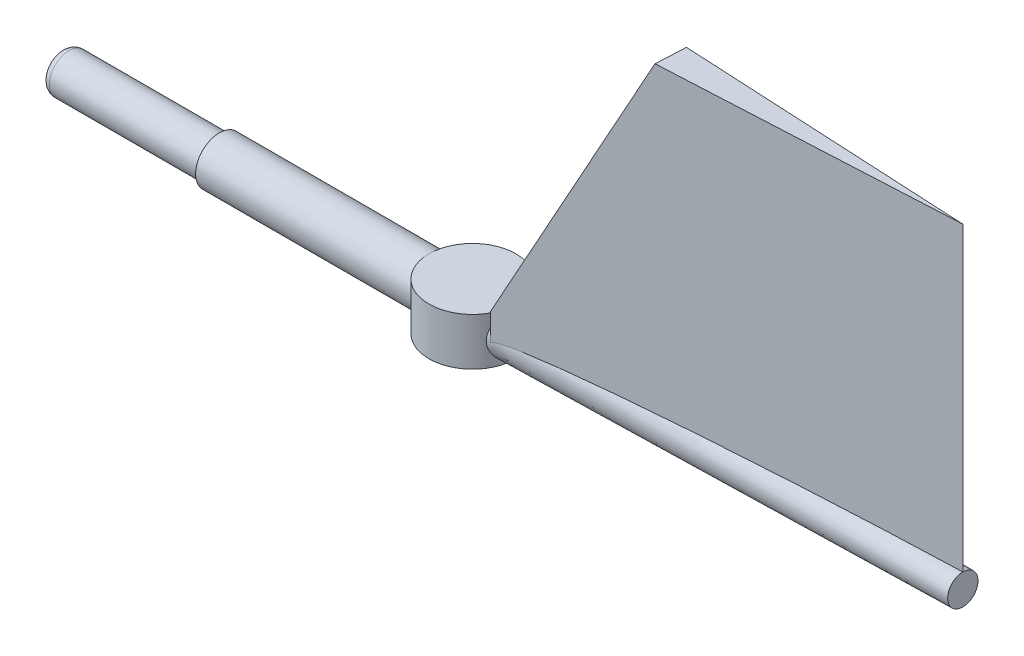
ISO-10303-21;
HEADER;
FILE_DESCRIPTION(('STEP AP214'),'2;1');
FILE_NAME('part.step','',(''),(''),'','','');
FILE_SCHEMA(('AUTOMOTIVE_DESIGN { 1 0 10303 214 1 1 1 1 }'));
ENDSEC;
DATA;
#1=APPLICATION_CONTEXT('core data for automotive mechanical design processes');
#2=APPLICATION_PROTOCOL_DEFINITION('international standard','automotive_design',2000,#1);
#3=PRODUCT_CONTEXT('',#1,'mechanical');
#4=PRODUCT('Part','Part','',(#3));
#5=PRODUCT_RELATED_PRODUCT_CATEGORY('part','',(#4));
#6=PRODUCT_DEFINITION_FORMATION('','',#4);
#7=PRODUCT_DEFINITION_CONTEXT('part definition',#1,'design');
#8=PRODUCT_DEFINITION('design','',#6,#7);
#9=PRODUCT_DEFINITION_SHAPE('','',#8);
#10=(LENGTH_UNIT() NAMED_UNIT(*) SI_UNIT(.MILLI.,.METRE.));
#11=(NAMED_UNIT(*) PLANE_ANGLE_UNIT() SI_UNIT($,.RADIAN.));
#12=(NAMED_UNIT(*) SI_UNIT($,.STERADIAN.) SOLID_ANGLE_UNIT());
#13=UNCERTAINTY_MEASURE_WITH_UNIT(LENGTH_MEASURE(1.E-05),#10,'distance_accuracy_value','');
#14=(GEOMETRIC_REPRESENTATION_CONTEXT(3) GLOBAL_UNCERTAINTY_ASSIGNED_CONTEXT((#13)) GLOBAL_UNIT_ASSIGNED_CONTEXT((#10,
#11,#12)) REPRESENTATION_CONTEXT('',''));
#15=CARTESIAN_POINT('',(0.,0.,0.));
#16=DIRECTION('',(0.,0.,1.));
#17=DIRECTION('',(1.,0.,0.));
#18=AXIS2_PLACEMENT_3D('',#15,#16,#17);
#19=CARTESIAN_POINT('',(0.,30.,0.));
#20=DIRECTION('',(0.,1.,0.));
#21=DIRECTION('',(0.,0.,1.));
#22=AXIS2_PLACEMENT_3D('',#19,#20,#21);
#23=PLANE('',#22);
#24=DIRECTION('',(-0.0511518511842649,0.,0.998690887172013));
#25=VECTOR('',#24,1.);
#26=CARTESIAN_POINT('',(25.188881317331,30.,1.29014685644198));
#27=LINE('',#26,#25);
#28=CARTESIAN_POINT('',(25.7494686858501,30.,-9.65478443034477));
#29=VERTEX_POINT('',#28);
#30=CARTESIAN_POINT('',(24.6282939488119,30.,12.2350781432287));
#31=VERTEX_POINT('',#30);
#32=EDGE_CURVE('E234',#29,#31,#27,.T.);
#33=ORIENTED_EDGE('',*,*,#32,.F.);
#34=CARTESIAN_POINT('',(0.,30.,0.));
#35=DIRECTION('',(0.,1.,0.));
#36=DIRECTION('',(0.,0.,1.));
#37=AXIS2_PLACEMENT_3D('',#34,#35,#36);
#38=CIRCLE('',#37,27.5);
#39=CARTESIAN_POINT('',(-27.5,30.,0.));
#40=VERTEX_POINT('',#39);
#41=EDGE_CURVE('E236',#29,#40,#38,.T.);
#42=ORIENTED_EDGE('',*,*,#41,.T.);
#43=EDGE_CURVE('E188',#40,#31,#38,.T.);
#44=ORIENTED_EDGE('',*,*,#43,.T.);
#45=EDGE_LOOP('',(#33,#42,#44));
#46=FACE_BOUND('',#45,.T.);
#47=ADVANCED_FACE('F45',(#46),#23,.T.);
#48=CARTESIAN_POINT('',(0.,30.,0.));
#49=DIRECTION('',(0.,-1.,0.));
#50=DIRECTION('',(0.,0.,-1.));
#51=AXIS2_PLACEMENT_3D('',#48,#49,#50);
#52=CYLINDRICAL_SURFACE('',#51,27.5);
#53=ORIENTED_EDGE('',*,*,#41,.F.);
#54=DIRECTION('',(0.,-1.,0.));
#55=VECTOR('',#54,1.);
#56=CARTESIAN_POINT('',(25.7494686858501,30.,-9.65478443034477));
#57=LINE('',#56,#55);
#58=CARTESIAN_POINT('',(25.74946868585,29.7622417594212,-9.65478443034478));
#59=VERTEX_POINT('',#58);
#60=EDGE_CURVE('E248',#29,#59,#57,.T.);
#61=ORIENTED_EDGE('',*,*,#60,.T.);
#62=CARTESIAN_POINT('',(0.,-16.9582397002913,0.));
#63=DIRECTION('',(0.878809806357377,-0.475044496307877,0.0450116737936376));
#64=DIRECTION('',(-0.474422609463896,-0.879961775605961,-0.0242994053810446));
#65=AXIS2_PLACEMENT_3D('',#62,#63,#64);
#66=ELLIPSE('',#65,57.8893139773946,27.5);
#67=CARTESIAN_POINT('',(25.8622948656145,30.,-9.34835302521294));
#68=VERTEX_POINT('',#67);
#69=EDGE_CURVE('E243',#59,#68,#66,.T.);
#70=ORIENTED_EDGE('',*,*,#69,.T.);
#71=CARTESIAN_POINT('',(26.,30.,-8.95823643358439));
#72=VERTEX_POINT('',#71);
#73=EDGE_CURVE('E251',#72,#68,#38,.T.);
#74=ORIENTED_EDGE('',*,*,#73,.F.);
#75=DIRECTION('',(0.,-1.,0.));
#76=VECTOR('',#75,1.);
#77=CARTESIAN_POINT('',(26.,30.,-8.95823643358439));
#78=LINE('',#77,#76);
#79=CARTESIAN_POINT('',(26.,26.4604106626746,-8.95823643358439));
#80=VERTEX_POINT('',#79);
#81=EDGE_CURVE('E156',#80,#72,#78,.F.);
#82=ORIENTED_EDGE('',*,*,#81,.F.);
#83=CARTESIAN_POINT('',(25.3739548760708,5.02520029589029,-10.6024720677361));
#84=CARTESIAN_POINT('',(25.2589807896453,5.31474524438891,-10.8776317207242));
#85=CARTESIAN_POINT('',(25.1437529125648,5.61552790973988,-11.1408027092725));
#86=CARTESIAN_POINT('',(24.9156567978218,6.23838173601328,-11.6419868356179));
#87=CARTESIAN_POINT('',(24.8027891652163,6.56045826972817,-11.8799935843871));
#88=CARTESIAN_POINT('',(24.5823460763896,7.22493664086616,-12.3296825254285));
#89=CARTESIAN_POINT('',(24.4747782842272,7.56736641945178,-12.5413272342094));
#90=CARTESIAN_POINT('',(24.2682963971694,8.27062803539316,-12.9363624297135));
#91=CARTESIAN_POINT('',(24.1693814022499,8.63145795265656,-13.1197558565181));
#92=CARTESIAN_POINT('',(23.9828436160495,9.37215898739739,-13.4577389026124));
#93=CARTESIAN_POINT('',(23.8952970187322,9.75213704225914,-13.6121369825039));
#94=CARTESIAN_POINT('',(23.7355478572148,10.5265132873885,-13.8888196629213));
#95=CARTESIAN_POINT('',(23.6633358988442,10.9209024746401,-14.0111239353594));
#96=CARTESIAN_POINT('',(23.5372636868414,11.7209711468181,-14.2218957167232));
#97=CARTESIAN_POINT('',(23.4833798033984,12.1266353592669,-14.3104068123089));
#98=CARTESIAN_POINT('',(23.3962990579469,12.9462341609028,-14.4523418384537));
#99=CARTESIAN_POINT('',(23.3630988876827,13.3601674165618,-14.5057713802043));
#100=CARTESIAN_POINT('',(23.321409946645,14.1465238990861,-14.5726857244963));
#101=CARTESIAN_POINT('',(23.3106067160397,14.5185105282431,-14.5899145953292));
#102=CARTESIAN_POINT('',(23.3070786393187,15.2627749480068,-14.5955511733385));
#103=CARTESIAN_POINT('',(23.3143524374883,15.635052714686,-14.5839610418406));
#104=CARTESIAN_POINT('',(23.3466885029954,16.376865656022,-14.5321385998695));
#105=CARTESIAN_POINT('',(23.3717532036468,16.7464004485274,-14.4919023713833));
#106=CARTESIAN_POINT('',(23.4386902785931,17.4797653997153,-14.3833877749931));
#107=CARTESIAN_POINT('',(23.4805626844626,17.8435955476798,-14.3151093544095));
#108=CARTESIAN_POINT('',(23.5762929425411,18.5391974846344,-14.1568484769866));
#109=CARTESIAN_POINT('',(23.6291768894959,18.8714998528014,-14.0685967309989));
#110=CARTESIAN_POINT('',(23.7466645207108,19.5271482386261,-13.8693640153953));
#111=CARTESIAN_POINT('',(23.8112721677085,19.8504911851739,-13.7583753588165));
#112=CARTESIAN_POINT('',(24.0200117773653,20.8045769240625,-13.3928343874975));
#113=CARTESIAN_POINT('',(24.1791217073796,21.4197953380689,-13.1056103540417));
#114=CARTESIAN_POINT('',(24.5422598365895,22.6683134964539,-12.4135724270906));
#115=CARTESIAN_POINT('',(24.7493693678085,23.2952414686588,-11.9989062342224));
#116=CARTESIAN_POINT('',(25.0677300994055,24.1805027246535,-11.3103151053874));
#117=CARTESIAN_POINT('',(25.1752201251041,24.466603389379,-11.0694717123964));
#118=CARTESIAN_POINT('',(25.3903993188432,25.019374350434,-10.5665660557872));
#119=CARTESIAN_POINT('',(25.4980884203296,25.286050240048,-10.3045099465373));
#120=CARTESIAN_POINT('',(25.7246989046915,25.8309661974467,-9.72615145501654));
#121=CARTESIAN_POINT('',(25.8433397231763,26.106478104043,-9.40716432386659));
#122=CARTESIAN_POINT('',(26.07478771349,26.6298179880697,-8.74519209254233));
#123=CARTESIAN_POINT('',(26.1875943767586,26.8776435542739,-8.40220490640742));
#124=CARTESIAN_POINT('',(26.4043337401277,27.343708338476,-7.69403990666647));
#125=CARTESIAN_POINT('',(26.5082670286885,27.5619495190026,-7.32886356734413));
#126=CARTESIAN_POINT('',(26.7044001939237,27.9668742978705,-6.5784024134819));
#127=CARTESIAN_POINT('',(26.7966008619495,28.1535600248687,-6.19311895761753));
#128=CARTESIAN_POINT('',(26.9643247301294,28.4887691710254,-5.4156277171668));
#129=CARTESIAN_POINT('',(27.0402320135855,28.6381892935451,-5.02389015001652));
#130=CARTESIAN_POINT('',(27.176276844047,28.9034928477338,-4.22652428886465));
#131=CARTESIAN_POINT('',(27.2364144631062,29.0193764326362,-3.82089605834098));
#132=CARTESIAN_POINT('',(27.3390767482759,29.2159666478532,-2.99935021046283));
#133=CARTESIAN_POINT('',(27.3816155749622,29.2967015627089,-2.583441152116));
#134=CARTESIAN_POINT('',(27.44781920486,29.4219297574201,-1.74473187394965));
#135=CARTESIAN_POINT('',(27.4714861980969,29.4664272425445,-1.32193245954995));
#136=CARTESIAN_POINT('',(27.4976824595051,29.515648503416,-0.519979469652379));
#137=CARTESIAN_POINT('',(27.5022441836775,29.5241970666347,-0.141121207491285));
#138=CARTESIAN_POINT('',(27.4957059959917,29.5119277203421,0.615964382808418));
#139=CARTESIAN_POINT('',(27.484607392897,29.4911122648383,0.994191761026542));
#140=CARTESIAN_POINT('',(27.4470349072439,29.4203831666642,1.7470988535439));
#141=CARTESIAN_POINT('',(27.4205623724584,29.3704720746942,2.12177887590021));
#142=CARTESIAN_POINT('',(27.3529101857643,29.2421633051996,2.86487370013073));
#143=CARTESIAN_POINT('',(27.3117303752413,29.1637653204505,3.23328843439041));
#144=CARTESIAN_POINT('',(27.2172049432116,28.9823243275214,3.94970172019371));
#145=CARTESIAN_POINT('',(27.1642884666744,28.8801455718904,4.29797682160703));
#146=CARTESIAN_POINT('',(27.0467912052996,28.6509475468669,4.98420184498652));
#147=CARTESIAN_POINT('',(26.9822108111078,28.5239291093887,5.32215211230707));
#148=CARTESIAN_POINT('',(26.8427480914521,28.2461625241432,5.98597766963605));
#149=CARTESIAN_POINT('',(26.7678647374124,28.095412006913,6.3118517499136));
#150=CARTESIAN_POINT('',(26.6093197655124,27.7713574321773,6.9499797430459));
#151=CARTESIAN_POINT('',(26.5256572607284,27.5980510955188,7.26223227524816));
#152=CARTESIAN_POINT('',(26.3442575516158,27.2154299123784,7.89602426583035));
#153=CARTESIAN_POINT('',(26.2459301722321,27.0043476807044,8.21632829137412));
#154=CARTESIAN_POINT('',(26.0431389937305,26.5587006428767,8.83809183243358));
#155=CARTESIAN_POINT('',(25.9386749341642,26.3241348397529,9.13955054700836));
#156=CARTESIAN_POINT('',(25.7258315340878,25.832716158324,9.72254826084306));
#157=CARTESIAN_POINT('',(25.6174500012751,25.5758506843077,10.0040758371021));
#158=CARTESIAN_POINT('',(25.3991739959588,25.0411084167323,10.5459625070168));
#159=CARTESIAN_POINT('',(25.2892790255165,24.7632245659338,10.8063144291845));
#160=CARTESIAN_POINT('',(25.0593718645805,24.1584401910722,11.3299480019948));
#161=CARTESIAN_POINT('',(24.9394653561803,23.8294275551818,11.5908431125327));
#162=CARTESIAN_POINT('',(24.7043175806498,23.1489098396518,12.0839286020567));
#163=CARTESIAN_POINT('',(24.5890768791427,22.7974020462345,12.3161155077893));
#164=CARTESIAN_POINT('',(24.3668657227974,22.0734683623982,12.7501104539683));
#165=CARTESIAN_POINT('',(24.2598971690574,21.7010376972542,12.9519115211983));
#166=CARTESIAN_POINT('',(24.0580426601057,20.9374374553736,13.3231087578596));
#167=CARTESIAN_POINT('',(23.9631501934803,20.5462781350461,13.4925224155111));
#168=CARTESIAN_POINT('',(23.791190924837,19.7570559686598,13.7934248917212));
#169=CARTESIAN_POINT('',(23.7137493997712,19.3593871515913,13.9257298385366));
#170=CARTESIAN_POINT('',(23.5770776281361,18.5511024140894,14.155895453191));
#171=CARTESIAN_POINT('',(23.5178470653846,18.1404867185786,14.2537567190519));
#172=CARTESIAN_POINT('',(23.4204107678903,17.3104488084701,14.4132966956237));
#173=CARTESIAN_POINT('',(23.3821733768986,16.891040849077,14.4750298942799));
#174=CARTESIAN_POINT('',(23.3285058876373,16.046995363706,14.5613686915601));
#175=CARTESIAN_POINT('',(23.3130716982874,15.6223587895717,14.5859809499999));
#176=CARTESIAN_POINT('',(23.3063287773289,14.8358525880745,14.5967456484932));
#177=CARTESIAN_POINT('',(23.3117646902336,14.4740688887894,14.5880874717275));
#178=CARTESIAN_POINT('',(23.3394815272933,13.7528470460417,14.5437031762805));
#179=CARTESIAN_POINT('',(23.3617605637132,13.3934086442771,14.5079800909653));
#180=CARTESIAN_POINT('',(23.4223461133257,12.6794641575445,14.4099617863203));
#181=CARTESIAN_POINT('',(23.460657114004,12.3249594822984,14.3476591270421));
#182=CARTESIAN_POINT('',(23.5519533780984,11.6233917410921,14.1972958516751));
#183=CARTESIAN_POINT('',(23.6049391905956,11.2763289541055,14.109234271769));
#184=CARTESIAN_POINT('',(23.7222882926122,10.6006797677343,13.9110003700438));
#185=CARTESIAN_POINT('',(23.7863185557411,10.2718475577895,13.8014650888252));
#186=CARTESIAN_POINT('',(23.9248357137863,9.62470144712515,13.5599266571158));
#187=CARTESIAN_POINT('',(23.9993262114333,9.30639121726544,13.427915762196));
#188=CARTESIAN_POINT('',(24.1568080322295,8.68170995146564,13.1424951265262));
#189=CARTESIAN_POINT('',(24.2397994761879,8.37533908528448,12.9890850816559));
#190=CARTESIAN_POINT('',(24.4123215503151,7.77559924336337,12.6618626518122));
#191=CARTESIAN_POINT('',(24.5018528536115,7.48223161101371,12.4880481655514));
#192=CARTESIAN_POINT('',(24.6982793337174,6.86962267055965,12.0954381981639));
#193=CARTESIAN_POINT('',(24.8058583961206,6.5524520305818,11.8737485657057));
#194=CARTESIAN_POINT('',(25.0241563702376,5.93755850739902,11.4064925926397));
#195=CARTESIAN_POINT('',(25.1348743399519,5.63982987633875,11.1609333627809));
#196=CARTESIAN_POINT('',(25.3569353055377,5.06459216496888,10.6467982657943));
#197=CARTESIAN_POINT('',(25.4682788360287,4.78710466512718,10.3781984785096));
#198=CARTESIAN_POINT('',(25.6888701437659,4.25402674771146,9.81947733492268));
#199=CARTESIAN_POINT('',(25.7981186034398,3.99842910259539,9.5293631416911));
#200=CARTESIAN_POINT('',(26.0227296767489,3.48609170814852,8.89889442872867));
#201=CARTESIAN_POINT('',(26.1376228424649,3.23175676429353,8.55641140071042));
#202=CARTESIAN_POINT('',(26.3588304631927,2.75288297493598,7.84853877678495));
#203=CARTESIAN_POINT('',(26.4651442512195,2.52834644517303,7.48314740383485));
#204=CARTESIAN_POINT('',(26.666183578984,2.11118350459486,6.73170409179548));
#205=CARTESIAN_POINT('',(26.7609135765313,1.91854480831209,6.34566018319344));
#206=CARTESIAN_POINT('',(26.9360742008022,1.56715840803802,5.55532732435332));
#207=CARTESIAN_POINT('',(27.016506278345,1.40840726512579,5.15104023048904));
#208=CARTESIAN_POINT('',(27.1563953097858,1.13504578195875,4.35145072526543));
#209=CARTESIAN_POINT('',(27.2168065315474,1.01839100319289,3.95701453544945));
#210=CARTESIAN_POINT('',(27.3210861179503,0.818331138354284,3.15763692159677));
#211=CARTESIAN_POINT('',(27.3649549894543,0.734925033527394,2.75269581984021));
#212=CARTESIAN_POINT('',(27.4348282741273,0.602570259093007,1.93598782842031));
#213=CARTESIAN_POINT('',(27.4608454468289,0.553596977945974,1.52422602990169));
#214=CARTESIAN_POINT('',(27.494271218503,0.490742243127113,0.697294240145706));
#215=CARTESIAN_POINT('',(27.501681506155,0.476857604963127,0.282124561623907));
#216=CARTESIAN_POINT('',(27.497885215065,0.48398388355591,-0.504613086786452));
#217=CARTESIAN_POINT('',(27.4885337906107,0.501517432419844,-0.876227286644535));
#218=CARTESIAN_POINT('',(27.4549555929053,0.564691646689673,-1.61635658718643));
#219=CARTESIAN_POINT('',(27.4307299977756,0.610330086024461,-1.98487193097465));
#220=CARTESIAN_POINT('',(27.3679869526378,0.729185080219863,-2.71625778760095));
#221=CARTESIAN_POINT('',(27.329466478021,0.802407471531994,-3.07912708886844));
#222=CARTESIAN_POINT('',(27.2390488232539,0.97561006762349,-3.79671015581259));
#223=CARTESIAN_POINT('',(27.1871514263604,1.07559070596162,-4.15142378924339));
#224=CARTESIAN_POINT('',(27.07143162372,1.30076754647395,-4.84891886013749));
#225=CARTESIAN_POINT('',(27.0076642293836,1.42584762610448,-5.19174701943964));
#226=CARTESIAN_POINT('',(26.8694388353132,1.70035583966426,-5.86527633034215));
#227=CARTESIAN_POINT('',(26.7949804378047,1.84978487956006,-6.19597703014767));
#228=CARTESIAN_POINT('',(26.6369754194599,2.17168046962517,-6.84342837755385));
#229=CARTESIAN_POINT('',(26.5534344654054,2.3441326703416,-7.16018755217063));
#230=CARTESIAN_POINT('',(26.3789242583845,2.71088796406311,-7.77853394346995));
#231=CARTESIAN_POINT('',(26.2879560758362,2.90518790987085,-8.08012333634425));
#232=CARTESIAN_POINT('',(26.0649709461134,3.39166133444143,-8.7776474029461));
#233=CARTESIAN_POINT('',(25.9303994272193,3.69313231412289,-9.16632626306055));
#234=CARTESIAN_POINT('',(25.6553309164623,4.33250951580472,-9.91016253755733));
#235=CARTESIAN_POINT('',(25.514833413983,4.67041888146467,-10.2653170547192));
#236=CARTESIAN_POINT('',(25.3739548760708,5.02520029589029,-10.6024720677361));
#237=B_SPLINE_CURVE_WITH_KNOTS('',3,(#83,#84,#85,#86,#87,#88,#89,#90,#91,#92,#93,#94,#95,#96,
#97,#98,#99,#100,#101,#102,#103,#104,#105,#106,#107,#108,#109,#110,#111,#112,#113,#114,#115,
#116,#117,#118,#119,#120,#121,#122,#123,#124,#125,#126,#127,#128,#129,#130,#131,#132,#133,#134,
#135,#136,#137,#138,#139,#140,#141,#142,#143,#144,#145,#146,#147,#148,#149,#150,#151,#152,#153,
#154,#155,#156,#157,#158,#159,#160,#161,#162,#163,#164,#165,#166,#167,#168,#169,#170,#171,#172,
#173,#174,#175,#176,#177,#178,#179,#180,#181,#182,#183,#184,#185,#186,#187,#188,#189,#190,#191,
#192,#193,#194,#195,#196,#197,#198,#199,#200,#201,#202,#203,#204,#205,#206,#207,#208,#209,#210,
#211,#212,#213,#214,#215,#216,#217,#218,#219,#220,#221,#222,#223,#224,#225,#226,#227,#228,#229,
#230,#231,#232,#233,#234,#235,#236),.UNSPECIFIED.,.T.,.F.,(4,2,2,2,2,2,2,2,2,2,2,2,2,2,2,2,2,2,
2,2,2,2,2,2,2,2,2,2,2,2,2,2,2,2,2,2,2,2,2,2,2,2,2,2,2,2,2,2,2,2,2,2,2,2,2,2,2,2,2,2,2,2,2,2,2,2,
2,2,2,2,2,2,2,2,2,2,4),(0.,1.24657017777306,2.49345609496434,3.74209516444599,4.99060420144898,
6.24709099992977,7.50280582575517,8.75689550640142,10.010784550193,11.1268950195776,
12.2429217870584,13.3591012262182,14.4752827622261,15.517766388665,16.560603044473,
18.6449878448924,20.9743285440373,22.1408240271324,23.3069822838403,24.6190556785266,
25.931243253832,27.2433437403745,28.5553556803371,29.8318304024429,31.1082992920579,
32.3837390851638,33.659030845369,34.7945463874952,35.9299670380209,37.0652881656386,
38.2006215377942,39.2998029742727,40.3989476039942,41.498202044409,42.5975676453691,
43.7843390597823,44.9711608786943,46.1586574768928,47.346554580386,48.6550636121095,
49.9637307988183,51.2726978540427,52.5809560978885,53.8576617178647,55.1343451701885,
56.4090981473951,57.6836223957467,58.7680260098334,59.8523081046978,60.9368939027471,
62.0215202877525,63.0778394751476,64.1345233781331,65.1912223000193,66.2480301383499,
67.4517143936581,68.6550411641869,69.8596326801444,71.0638249210045,72.3875424376168,
73.7113627648109,75.0346720299224,76.3578469412317,77.6033317359527,78.8487783655326,
80.0933338800955,81.3377764401724,82.4528589302165,83.5678531105871,84.6830833437151,
85.7983316477999,86.9085345228061,88.0187787152414,89.1283341376688,90.2377299314001,
91.765029062839,93.2924600649835),.UNSPECIFIED.);
#238=CARTESIAN_POINT('',(26.,26.4604106626746,8.95823643358439));
#239=VERTEX_POINT('',#238);
#240=EDGE_CURVE('E173',#239,#80,#237,.T.);
#241=ORIENTED_EDGE('',*,*,#240,.F.);
#242=DIRECTION('',(0.,-1.,0.));
#243=VECTOR('',#242,1.);
#244=CARTESIAN_POINT('',(26.,30.,8.95823643358439));
#245=LINE('',#244,#243);
#246=CARTESIAN_POINT('',(26.,30.,8.95823643358439));
#247=VERTEX_POINT('',#246);
#248=EDGE_CURVE('E163',#247,#239,#245,.T.);
#249=ORIENTED_EDGE('',*,*,#248,.F.);
#250=CARTESIAN_POINT('',(24.7718377342979,30.,11.9417777263527));
#251=VERTEX_POINT('',#250);
#252=EDGE_CURVE('E253',#251,#247,#38,.T.);
#253=ORIENTED_EDGE('',*,*,#252,.F.);
#254=CARTESIAN_POINT('',(24.6282939488119,29.7622417594212,12.2350781432287));
#255=VERTEX_POINT('',#254);
#256=EDGE_CURVE('E61',#251,#255,#66,.T.);
#257=ORIENTED_EDGE('',*,*,#256,.T.);
#258=DIRECTION('',(0.,-1.,0.));
#259=VECTOR('',#258,1.);
#260=CARTESIAN_POINT('',(24.6282939488119,30.,12.2350781432287));
#261=LINE('',#260,#259);
#262=EDGE_CURVE('E242',#255,#31,#261,.F.);
#263=ORIENTED_EDGE('',*,*,#262,.T.);
#264=ORIENTED_EDGE('',*,*,#43,.F.);
#265=CARTESIAN_POINT('',(-27.5,30.,0.));
#266=CARTESIAN_POINT('',(-27.5000029768637,30.0000033905131,0.390025926031639));
#267=CARTESIAN_POINT('',(-27.4916861614045,29.9847736809685,0.780011319275115));
#268=CARTESIAN_POINT('',(-27.4586380253817,29.9240565910686,1.55705345313805));
#269=CARTESIAN_POINT('',(-27.433901642081,29.8785598783093,1.94410925321924));
#270=CARTESIAN_POINT('',(-27.3686019985479,29.7578097587313,2.71267021647318));
#271=CARTESIAN_POINT('',(-27.3280191771369,29.6825195726702,3.0941679125022));
#272=CARTESIAN_POINT('',(-27.2320495631699,29.5031121824854,3.84837478107718));
#273=CARTESIAN_POINT('',(-27.1766637496011,29.3989968846772,4.2210845330355));
#274=CARTESIAN_POINT('',(-27.0526800176246,29.1635962338135,4.9537874968714));
#275=CARTESIAN_POINT('',(-26.9841378431476,29.0324253472095,5.31382703510725));
#276=CARTESIAN_POINT('',(-26.835260068349,28.7439601547889,6.02073993698791));
#277=CARTESIAN_POINT('',(-26.7549243141161,28.5866655080422,6.36761312873177));
#278=CARTESIAN_POINT('',(-26.5842202055101,28.247349064103,7.04639678409534));
#279=CARTESIAN_POINT('',(-26.4938530255157,28.0653301608215,7.37830899281341));
#280=CARTESIAN_POINT('',(-26.3049560932214,27.6779067054886,8.02577344173227));
#281=CARTESIAN_POINT('',(-26.2064255180262,27.4724997950711,8.34132402740591));
#282=CARTESIAN_POINT('',(-25.9962766794739,27.0248936742744,8.97567240061469));
#283=CARTESIAN_POINT('',(-25.8842240637397,26.7811422470175,9.29323125552219));
#284=CARTESIAN_POINT('',(-25.655600915709,26.2699652949713,9.90693648044711));
#285=CARTESIAN_POINT('',(-25.5390302178094,26.0025389019508,10.2030820644522));
#286=CARTESIAN_POINT('',(-25.3039217654193,25.4452061124606,10.772957453928));
#287=CARTESIAN_POINT('',(-25.1853828103385,25.1552855671109,11.0466729245871));
#288=CARTESIAN_POINT('',(-24.949095424736,24.5542529337534,11.5704465235238));
#289=CARTESIAN_POINT('',(-24.83134739803,24.2431308088024,11.8204933112118));
#290=CARTESIAN_POINT('',(-24.5883351282199,23.5699503034928,12.3185959703622));
#291=CARTESIAN_POINT('',(-24.4634457148746,23.2058760189773,12.5641191834341));
#292=CARTESIAN_POINT('',(-24.2221333137375,22.455720496586,13.0232682298902));
#293=CARTESIAN_POINT('',(-24.1057061765752,22.0696502121131,13.2369097509271));
#294=CARTESIAN_POINT('',(-23.8853676018497,21.2773780133631,13.6304838253342));
#295=CARTESIAN_POINT('',(-23.7814524105911,20.8711821888063,13.8104264977025));
#296=CARTESIAN_POINT('',(-23.5902234111617,20.0409977119816,14.1345968487277));
#297=CARTESIAN_POINT('',(-23.5029074434359,19.6170113830274,14.2788291740314));
#298=CARTESIAN_POINT('',(-23.3536203509628,18.7814952678535,14.5216202180834));
#299=CARTESIAN_POINT('',(-23.2904005035301,18.3708593998965,14.6224811449739));
#300=CARTESIAN_POINT('',(-23.1847259735726,17.539925746271,14.7894657297646));
#301=CARTESIAN_POINT('',(-23.1422702285126,17.1196284561469,14.8555911651531));
#302=CARTESIAN_POINT('',(-23.0801812722155,16.2737508412634,14.951873960348));
#303=CARTESIAN_POINT('',(-23.0605210217293,15.8481773820625,14.9820739348353));
#304=CARTESIAN_POINT('',(-23.0449228176138,14.995594891239,15.0060578570553));
#305=CARTESIAN_POINT('',(-23.0489817247583,14.568586057064,14.9998466238043));
#306=CARTESIAN_POINT('',(-23.0782283378165,13.7811208460319,14.954794835107));
#307=CARTESIAN_POINT('',(-23.1001725194712,13.4202423862242,14.9209620037933));
#308=CARTESIAN_POINT('',(-23.1602570339157,12.7032459772465,14.8275280005585));
#309=CARTESIAN_POINT('',(-23.1983954450444,12.347127468415,14.7679298860161));
#310=CARTESIAN_POINT('',(-23.2895875400534,11.6418358424278,14.6236920147679));
#311=CARTESIAN_POINT('',(-23.3426466544308,11.2926653036719,14.5390431400696));
#312=CARTESIAN_POINT('',(-23.4619907126698,10.6033801640077,14.3456573247184));
#313=CARTESIAN_POINT('',(-23.5282764720741,10.2632661229811,14.2369188986805));
#314=CARTESIAN_POINT('',(-23.6736941826906,9.58655730182434,13.993808592953));
#315=CARTESIAN_POINT('',(-23.7530721050962,9.25019616426513,13.8589349805158));
#316=CARTESIAN_POINT('',(-23.9214582195211,8.58999949107903,13.5662205947533));
#317=CARTESIAN_POINT('',(-24.0104698077622,8.26616842773866,13.4083717149935));
#318=CARTESIAN_POINT('',(-24.1959004001043,7.63226681705534,13.0707874760883));
#319=CARTESIAN_POINT('',(-24.2923208294074,7.32219893545721,12.8910479020284));
#320=CARTESIAN_POINT('',(-24.4903603605917,6.71691186367087,12.510724003029));
#321=CARTESIAN_POINT('',(-24.5919792512718,6.42169207120546,12.3101405245861));
#322=CARTESIAN_POINT('',(-24.8142981239363,5.80242607535837,11.8563873360525));
#323=CARTESIAN_POINT('',(-24.9355149880728,5.48100086539305,11.5998852325036));
#324=CARTESIAN_POINT('',(-25.1789315319098,4.86047045099108,11.0615853728645));
#325=CARTESIAN_POINT('',(-25.3011312701528,4.56136658714009,10.7797860997006));
#326=CARTESIAN_POINT('',(-25.5436170163428,3.98663051419691,10.1918989000826));
#327=CARTESIAN_POINT('',(-25.6639013045802,3.7110185257947,9.88579047857691));
#328=CARTESIAN_POINT('',(-25.8995157920741,3.18517263901833,9.25092860627508));
#329=CARTESIAN_POINT('',(-26.0148479046461,2.93492888761503,8.92218403132097));
#330=CARTESIAN_POINT('',(-26.2451366569457,2.44584743317257,8.22116899818339));
#331=CARTESIAN_POINT('',(-26.3595761221473,2.2088240902676,7.84745806399649));
#332=CARTESIAN_POINT('',(-26.5765607059835,1.76744477280032,7.07786999641931));
#333=CARTESIAN_POINT('',(-26.6791050829843,1.56309083480689,6.68199148320607));
#334=CARTESIAN_POINT('',(-26.8692348010223,1.18943764326643,5.87090841300042));
#335=CARTESIAN_POINT('',(-26.9568311649418,1.02011253921538,5.45571838663561));
#336=CARTESIAN_POINT('',(-27.1144564172653,0.718533268343672,4.60886601765793));
#337=CARTESIAN_POINT('',(-27.1844877596501,0.586273922822533,4.17720598576208));
#338=CARTESIAN_POINT('',(-27.2991774682105,0.37117352230469,3.34156229985676));
#339=CARTESIAN_POINT('',(-27.3455807843775,0.284898634850698,2.93870005602793));
#340=CARTESIAN_POINT('',(-27.4207641371914,0.145648612919121,2.12563247046865));
#341=CARTESIAN_POINT('',(-27.4495452257549,0.0926714908067882,1.71542756854521));
#342=CARTESIAN_POINT('',(-27.488643235048,0.0208005861741679,0.891380587975852));
#343=CARTESIAN_POINT('',(-27.4989697634382,0.00188906865969596,0.477540514684416));
#344=CARTESIAN_POINT('',(-27.5008830923673,-0.00161930343297784,-0.350316913442313));
#345=CARTESIAN_POINT('',(-27.4924710652538,0.0137816952812828,-0.764334255566828));
#346=CARTESIAN_POINT('',(-27.4588592415785,0.0755393469310441,-1.54928782157928));
#347=CARTESIAN_POINT('',(-27.4353473792204,0.118784563958674,-1.92054665490984));
#348=CARTESIAN_POINT('',(-27.3737813435291,0.232596727132049,-2.65759801913595));
#349=CARTESIAN_POINT('',(-27.3357283282121,0.303161497631945,-3.02339098290806));
#350=CARTESIAN_POINT('',(-27.2459535727828,0.470822709588658,-3.74713343528903));
#351=CARTESIAN_POINT('',(-27.194231148095,0.56792047984858,-4.10508253009785));
#352=CARTESIAN_POINT('',(-27.0782660216347,0.787639413252548,-4.81097326625502));
#353=CARTESIAN_POINT('',(-27.0140227733037,0.910261690607092,-5.15891446997822));
#354=CARTESIAN_POINT('',(-26.872768976388,1.18299482064512,-5.85079671163859));
#355=CARTESIAN_POINT('',(-26.7954977463648,1.33367531077708,-6.19445960371795));
#356=CARTESIAN_POINT('',(-26.6309248216772,1.65923990728275,-6.86759887040171));
#357=CARTESIAN_POINT('',(-26.5436230894613,1.8341241042694,-7.1970751918889));
#358=CARTESIAN_POINT('',(-26.3607434362847,2.20683127805923,-7.84047788557652));
#359=CARTESIAN_POINT('',(-26.2651634867318,2.40465988148153,-8.15440041649548));
#360=CARTESIAN_POINT('',(-26.067618832656,2.82196519124559,-8.76540734592561));
#361=CARTESIAN_POINT('',(-25.9656535506701,3.04144385656429,-9.06249021688594));
#362=CARTESIAN_POINT('',(-25.7457457189968,3.52632764831087,-9.67069784464785));
#363=CARTESIAN_POINT('',(-25.6272849233608,3.79412686581016,-9.97972935219738));
#364=CARTESIAN_POINT('',(-25.3876916995143,4.35346274465422,-10.5743982179738));
#365=CARTESIAN_POINT('',(-25.2665590957762,4.6450009689683,-10.8600340333475));
#366=CARTESIAN_POINT('',(-25.0244163361079,5.25071565783583,-11.4069323112262));
#367=CARTESIAN_POINT('',(-24.9034064091773,5.56491357484145,-11.6681711251379));
#368=CARTESIAN_POINT('',(-24.6646698727803,6.21437880189781,-12.1647014190706));
#369=CARTESIAN_POINT('',(-24.5469433853127,6.54964689332568,-12.3999919359193));
#370=CARTESIAN_POINT('',(-24.3093510821039,7.26585115829698,-12.8599138921207));
#371=CARTESIAN_POINT('',(-24.189988580563,7.64832608966422,-13.0824177962915));
#372=CARTESIAN_POINT('',(-23.9628649457967,8.43415607402571,-13.493938185748));
#373=CARTESIAN_POINT('',(-23.8551024721244,8.83750870649317,-13.6829585418745));
#374=CARTESIAN_POINT('',(-23.655448435903,9.6623848628194,-14.0252992956793));
#375=CARTESIAN_POINT('',(-23.5635395786692,10.0838879507753,-14.1786586602891));
#376=CARTESIAN_POINT('',(-23.3994923699125,10.9424634139354,-14.4477911756612));
#377=CARTESIAN_POINT('',(-23.3273503644268,11.3795328947422,-14.5635712737967));
#378=CARTESIAN_POINT('',(-23.2122512798224,12.2223159525227,-14.7462496378743));
#379=CARTESIAN_POINT('',(-23.1671373497733,12.6269420746047,-14.8168082378683));
#380=CARTESIAN_POINT('',(-23.0978610330349,13.4423995410176,-14.9245758031299));
#381=CARTESIAN_POINT('',(-23.073697103153,13.8532304260326,-14.9617872247822));
#382=CARTESIAN_POINT('',(-23.0474505859235,14.6769858379399,-15.0021867412136));
#383=CARTESIAN_POINT('',(-23.0453528534371,15.0899087342087,-15.0053981719028));
#384=CARTESIAN_POINT('',(-23.0633020262201,15.9141105175501,-14.9777962100737));
#385=CARTESIAN_POINT('',(-23.0833472127584,16.3253895297339,-14.9469854583535));
#386=CARTESIAN_POINT('',(-23.1405652803298,17.0882520713056,-14.8582153469349));
#387=CARTESIAN_POINT('',(-23.1751174402727,17.44052608952,-14.8043931284907));
#388=CARTESIAN_POINT('',(-23.259013223404,18.138765124074,-14.6722333670748));
#389=CARTESIAN_POINT('',(-23.3083615884264,18.4847280801046,-14.5938879646478));
#390=CARTESIAN_POINT('',(-23.4202923786491,19.1681864994198,-14.4135748412605));
#391=CARTESIAN_POINT('',(-23.482873531053,19.5056827735826,-14.3116093921055));
#392=CARTESIAN_POINT('',(-23.61949357723,20.1707311924271,-14.0849927426067));
#393=CARTESIAN_POINT('',(-23.6935375953281,20.4982788109713,-13.9603313919467));
#394=CARTESIAN_POINT('',(-23.855998752842,21.1618576552056,-13.6809725886486));
#395=CARTESIAN_POINT('',(-23.9450220385617,21.4971580082495,-13.5248931120392));
#396=CARTESIAN_POINT('',(-24.1313893555004,22.153531810689,-13.1894975318199));
#397=CARTESIAN_POINT('',(-24.2287342588874,22.4746037634735,-13.0101789915623));
#398=CARTESIAN_POINT('',(-24.4294058707453,23.1014869170569,-12.6293490683836));
#399=CARTESIAN_POINT('',(-24.5327345580013,23.407293006598,-12.4278303239398));
#400=CARTESIAN_POINT('',(-24.7430567453098,24.0025780029589,-12.0036328217286));
#401=CARTESIAN_POINT('',(-24.8500508109739,24.292054371501,-11.7809507887214));
#402=CARTESIAN_POINT('',(-25.0820518060558,24.8969129673809,-11.279549548959));
#403=CARTESIAN_POINT('',(-25.2072985276533,25.209433379213,-10.9974789941337));
#404=CARTESIAN_POINT('',(-25.4564030151187,25.8098590450877,-10.4078788863205));
#405=CARTESIAN_POINT('',(-25.5802611535331,26.0977710456919,-10.1003563569654));
#406=CARTESIAN_POINT('',(-25.8236204303152,26.6477569089118,-9.46085419289887));
#407=CARTESIAN_POINT('',(-25.9431175137971,26.9098070926104,-9.1288526223426));
#408=CARTESIAN_POINT('',(-26.1746278219764,27.4060185952981,-8.44216388542099));
#409=CARTESIAN_POINT('',(-26.2866412913125,27.6401808261383,-8.0874774613644));
#410=CARTESIAN_POINT('',(-26.5037317370901,28.0857501091423,-7.34549568865035));
#411=CARTESIAN_POINT('',(-26.6084732990014,28.2961925720691,-6.95752093840017));
#412=CARTESIAN_POINT('',(-26.8039748046143,28.6832368589565,-6.16156392197306));
#413=CARTESIAN_POINT('',(-26.894732850879,28.8598340912158,-5.75357895047386));
#414=CARTESIAN_POINT('',(-27.0593513909448,29.1766279969416,-4.92147583866173));
#415=CARTESIAN_POINT('',(-27.1332497830812,29.316906408169,-4.49739643228472));
#416=CARTESIAN_POINT('',(-27.2620537641562,29.5595381095306,-3.63592712597863));
#417=CARTESIAN_POINT('',(-27.3169694580608,29.6619115794861,-3.19854444305305));
#418=CARTESIAN_POINT('',(-27.4071125383922,29.8291913827189,-2.3037241969051));
#419=CARTESIAN_POINT('',(-27.4418389396959,29.8931455474902,-1.84605712451147));
#420=CARTESIAN_POINT('',(-27.488280840788,29.9785477270448,-0.925574329200201));
#421=CARTESIAN_POINT('',(-27.4999964680056,29.9999959772182,-0.462758634808958));
#422=CARTESIAN_POINT('',(-27.5,30.,0.));
#423=B_SPLINE_CURVE_WITH_KNOTS('',3,(#265,#266,#267,#268,#269,#270,#271,#272,#273,#274,#275,
#276,#277,#278,#279,#280,#281,#282,#283,#284,#285,#286,#287,#288,#289,#290,#291,#292,#293,#294,
#295,#296,#297,#298,#299,#300,#301,#302,#303,#304,#305,#306,#307,#308,#309,#310,#311,#312,#313,
#314,#315,#316,#317,#318,#319,#320,#321,#322,#323,#324,#325,#326,#327,#328,#329,#330,#331,#332,
#333,#334,#335,#336,#337,#338,#339,#340,#341,#342,#343,#344,#345,#346,#347,#348,#349,#350,#351,
#352,#353,#354,#355,#356,#357,#358,#359,#360,#361,#362,#363,#364,#365,#366,#367,#368,#369,#370,
#371,#372,#373,#374,#375,#376,#377,#378,#379,#380,#381,#382,#383,#384,#385,#386,#387,#388,#389,
#390,#391,#392,#393,#394,#395,#396,#397,#398,#399,#400,#401,#402,#403,#404,#405,#406,#407,#408,
#409,#410,#411,#412,#413,#414,#415,#416,#417,#418,#419,#420,#421,#422),.UNSPECIFIED.,.T.,.F.,(4,
2,2,2,2,2,2,2,2,2,2,2,2,2,2,2,2,2,2,2,2,2,2,2,2,2,2,2,2,2,2,2,2,2,2,2,2,2,2,2,2,2,2,2,2,2,2,2,2,
2,2,2,2,2,2,2,2,2,2,2,2,2,2,2,2,2,2,2,2,2,2,2,2,2,2,2,2,2,4),(0.,1.16962483796412,
2.33961048051881,3.51104496729539,4.68240200109693,5.84890134631389,7.01541591621123,
8.18179406602389,9.34828993372431,10.594126233825,11.8400082413781,13.0866803661028,
14.3339468281445,15.701872916328,17.0691236697704,18.4359632082972,19.8026247994503,
21.0833243443693,22.3639583468073,23.6430717451918,24.9220158569837,26.010098363937,
27.0980517914774,28.1864017011035,29.2748187381257,30.3866823406425,31.4989392007001,
32.6114105583455,33.7238367547998,35.008625675555,36.2934916967585,37.5794527302462,
38.8649123669687,40.2343848997525,41.603942770439,42.9724863035913,44.3408385331079,
45.5829312514178,46.8249498187705,48.0663215881111,49.3076156951992,50.4298276520625,
51.5519502577679,52.6741290709649,53.7963568804351,54.944512463286,56.0926723446749,
57.2411143851368,58.3896604363294,59.66550775425,60.9414391416136,62.2185947540802,
63.4957977572188,64.8689186390896,66.2418806785931,67.6133353512723,68.9845363350789,
70.2223061650686,71.459984812263,72.6968139230081,73.9335470379574,75.0064470066339,
76.0796911825736,77.1528321753844,78.2264542946421,79.3665661964429,80.5067977373948,
81.6474085203846,82.7881961131475,84.1044139825855,85.420269836785,86.7373195154468,
88.0543261187674,89.4133596687755,90.7725774652835,92.1287091317765,93.484117779652,
94.8718639639934,96.2596024632311),.UNSPECIFIED.);
#424=CARTESIAN_POINT('',(-27.5,0.,0.));
#425=VERTEX_POINT('',#424);
#426=EDGE_CURVE('E257',#40,#425,#423,.T.);
#427=ORIENTED_EDGE('',*,*,#426,.T.);
#428=CARTESIAN_POINT('',(0.,0.,0.));
#429=DIRECTION('',(0.,1.,0.));
#430=DIRECTION('',(0.,0.,1.));
#431=AXIS2_PLACEMENT_3D('',#428,#429,#430);
#432=CIRCLE('',#431,27.5);
#433=EDGE_CURVE('E252',#425,#425,#432,.T.);
#434=ORIENTED_EDGE('',*,*,#433,.T.);
#435=EDGE_CURVE('E181',#425,#40,#423,.T.);
#436=ORIENTED_EDGE('',*,*,#435,.T.);
#437=EDGE_LOOP('',(#53,#61,#70,#74,#82,#241,#249,#253,#257,#263,#264,#427,#434,#436));
#438=FACE_BOUND('',#437,.T.);
#439=ADVANCED_FACE('F194',(#438),#52,.T.);
#440=DIRECTION('',(0.0511518511842649,0.,-0.998690887172013));
#441=VECTOR('',#440,1.);
#442=CARTESIAN_POINT('',(25.3170662999562,30.,1.29671235056987));
#443=LINE('',#442,#441);
#444=EDGE_CURVE('E295',#251,#68,#443,.T.);
#445=ORIENTED_EDGE('',*,*,#444,.F.);
#446=ORIENTED_EDGE('',*,*,#252,.T.);
#447=DIRECTION('',(0.,0.,-1.));
#448=VECTOR('',#447,1.);
#449=CARTESIAN_POINT('',(26.,30.,0.));
#450=LINE('',#449,#448);
#451=EDGE_CURVE('E160',#247,#72,#450,.T.);
#452=ORIENTED_EDGE('',*,*,#451,.T.);
#453=ORIENTED_EDGE('',*,*,#73,.T.);
#454=EDGE_LOOP('',(#445,#446,#452,#453));
#455=FACE_BOUND('',#454,.T.);
#456=ADVANCED_FACE('F203',(#455),#23,.T.);
#457=CARTESIAN_POINT('',(0.,15.,0.));
#458=DIRECTION('',(-1.,0.,0.));
#459=DIRECTION('',(0.,0.,-1.));
#460=AXIS2_PLACEMENT_3D('',#457,#458,#459);
#461=CONICAL_SURFACE('',#460,15.,0.0174532925199433);
#462=CARTESIAN_POINT('',(26.,15.,0.));
#463=DIRECTION('',(1.,0.,0.));
#464=DIRECTION('',(0.,0.,-1.));
#465=AXIS2_PLACEMENT_3D('',#462,#463,#464);
#466=CIRCLE('',#465,14.5461683118663);
#467=CARTESIAN_POINT('',(25.9999999999999,15.,14.5461683118663));
#468=VERTEX_POINT('',#467);
#469=EDGE_CURVE('E54',#239,#468,#466,.T.);
#470=ORIENTED_EDGE('',*,*,#469,.F.);
#471=ORIENTED_EDGE('',*,*,#240,.T.);
#472=CARTESIAN_POINT('',(25.9999999999999,15.,-14.5461683118663));
#473=VERTEX_POINT('',#472);
#474=EDGE_CURVE('E268',#473,#80,#466,.T.);
#475=ORIENTED_EDGE('',*,*,#474,.F.);
#476=CARTESIAN_POINT('',(237.81488204654,15.,-3.69724251888365));
#477=DIRECTION('',(-0.0511518511842649,0.,0.998690887172013));
#478=DIRECTION('',(-0.998690887172013,0.,-0.0511518511842649));
#479=AXIS2_PLACEMENT_3D('',#476,#477,#478);
#480=ELLIPSE('',#479,212.092535104964,10.1994896253774);
#481=CARTESIAN_POINT('',(310.,24.588929872253,0.));
#482=VERTEX_POINT('',#481);
#483=EDGE_CURVE('E272',#482,#473,#480,.T.);
#484=ORIENTED_EDGE('',*,*,#483,.F.);
#485=CARTESIAN_POINT('',(310.,15.,0.));
#486=DIRECTION('',(1.,0.,0.));
#487=DIRECTION('',(0.,0.,-1.));
#488=AXIS2_PLACEMENT_3D('',#485,#486,#487);
#489=CIRCLE('',#488,9.58892987225254);
#490=EDGE_CURVE('E167',#482,#482,#489,.T.);
#491=ORIENTED_EDGE('',*,*,#490,.F.);
#492=CARTESIAN_POINT('',(237.81488204654,15.,3.69724251888364));
#493=DIRECTION('',(-0.0511518511842649,0.,-0.998690887172013));
#494=DIRECTION('',(-0.998690887172013,0.,0.0511518511842649));
#495=AXIS2_PLACEMENT_3D('',#492,#493,#494);
#496=ELLIPSE('',#495,212.092535104964,10.1994896253774);
#497=EDGE_CURVE('E275',#468,#482,#496,.T.);
#498=ORIENTED_EDGE('',*,*,#497,.F.);
#499=EDGE_LOOP('',(#470,#471,#475,#484,#491,#498));
#500=FACE_BOUND('',#499,.T.);
#501=ADVANCED_FACE('F197',(#500),#461,.T.);
#502=CARTESIAN_POINT('',(0.,0.,0.));
#503=DIRECTION('',(0.,1.,0.));
#504=DIRECTION('',(0.,0.,1.));
#505=AXIS2_PLACEMENT_3D('',#502,#503,#504);
#506=PLANE('',#505);
#507=CARTESIAN_POINT('',(0.,0.,0.));
#508=DIRECTION('',(0.,-1.,0.));
#509=DIRECTION('',(0.,0.,-1.));
#510=AXIS2_PLACEMENT_3D('',#507,#508,#509);
#511=CIRCLE('',#510,25.);
#512=CARTESIAN_POINT('',(0.,0.,-25.));
#513=VERTEX_POINT('',#512);
#514=EDGE_CURVE('E310',#513,#513,#511,.T.);
#515=ORIENTED_EDGE('',*,*,#514,.F.);
#516=EDGE_LOOP('',(#515));
#517=FACE_BOUND('',#516,.T.);
#518=ORIENTED_EDGE('',*,*,#433,.F.);
#519=EDGE_LOOP('',(#518));
#520=FACE_BOUND('',#519,.T.);
#521=ADVANCED_FACE('F202',(#517,#520),#506,.F.);
#522=CARTESIAN_POINT('',(310.,15.,0.));
#523=DIRECTION('',(1.,0.,0.));
#524=DIRECTION('',(0.,0.,-1.));
#525=AXIS2_PLACEMENT_3D('',#522,#523,#524);
#526=PLANE('',#525);
#527=ORIENTED_EDGE('',*,*,#490,.T.);
#528=EDGE_LOOP('',(#527));
#529=FACE_BOUND('',#528,.T.);
#530=ADVANCED_FACE('F205',(#529),#526,.T.);
#531=CARTESIAN_POINT('',(-160.,15.,0.));
#532=DIRECTION('',(1.,0.,0.));
#533=DIRECTION('',(0.,0.,-1.));
#534=AXIS2_PLACEMENT_3D('',#531,#532,#533);
#535=CYLINDRICAL_SURFACE('',#534,15.);
#536=CARTESIAN_POINT('',(-160.,15.,0.));
#537=DIRECTION('',(1.,0.,0.));
#538=DIRECTION('',(0.,0.,-1.));
#539=AXIS2_PLACEMENT_3D('',#536,#537,#538);
#540=CIRCLE('',#539,15.);
#541=CARTESIAN_POINT('',(-160.,15.,-15.));
#542=VERTEX_POINT('',#541);
#543=EDGE_CURVE('E177',#542,#542,#540,.T.);
#544=ORIENTED_EDGE('',*,*,#543,.T.);
#545=EDGE_LOOP('',(#544));
#546=FACE_BOUND('',#545,.T.);
#547=ORIENTED_EDGE('',*,*,#426,.F.);
#548=ORIENTED_EDGE('',*,*,#435,.F.);
#549=EDGE_LOOP('',(#547,#548));
#550=FACE_BOUND('',#549,.T.);
#551=ADVANCED_FACE('F210',(#546,#550),#535,.T.);
#552=CARTESIAN_POINT('',(-160.,15.,0.));
#553=DIRECTION('',(1.,0.,0.));
#554=DIRECTION('',(0.,0.,-1.));
#555=AXIS2_PLACEMENT_3D('',#552,#553,#554);
#556=PLANE('',#555);
#557=CARTESIAN_POINT('',(-160.,15.,0.));
#558=DIRECTION('',(-1.,0.,0.));
#559=DIRECTION('',(0.,0.,1.));
#560=AXIS2_PLACEMENT_3D('',#557,#558,#559);
#561=CIRCLE('',#560,12.5);
#562=CARTESIAN_POINT('',(-160.,15.,12.5));
#563=VERTEX_POINT('',#562);
#564=EDGE_CURVE('E168',#563,#563,#561,.T.);
#565=ORIENTED_EDGE('',*,*,#564,.F.);
#566=EDGE_LOOP('',(#565));
#567=FACE_BOUND('',#566,.T.);
#568=ORIENTED_EDGE('',*,*,#543,.F.);
#569=EDGE_LOOP('',(#568));
#570=FACE_BOUND('',#569,.T.);
#571=ADVANCED_FACE('F207',(#567,#570),#556,.F.);
#572=CARTESIAN_POINT('',(-260.,15.,0.));
#573=DIRECTION('',(1.,0.,0.));
#574=DIRECTION('',(0.,0.,-1.));
#575=AXIS2_PLACEMENT_3D('',#572,#573,#574);
#576=CYLINDRICAL_SURFACE('',#575,12.5);
#577=CARTESIAN_POINT('',(-255.,15.,0.));
#578=DIRECTION('',(-1.,0.,0.));
#579=DIRECTION('',(0.,0.,1.));
#580=AXIS2_PLACEMENT_3D('',#577,#578,#579);
#581=CIRCLE('',#580,12.5);
#582=CARTESIAN_POINT('',(-255.,15.,12.5));
#583=VERTEX_POINT('',#582);
#584=EDGE_CURVE('E264',#583,#583,#581,.F.);
#585=ORIENTED_EDGE('',*,*,#584,.T.);
#586=EDGE_LOOP('',(#585));
#587=FACE_BOUND('',#586,.T.);
#588=ORIENTED_EDGE('',*,*,#564,.T.);
#589=EDGE_LOOP('',(#588));
#590=FACE_BOUND('',#589,.T.);
#591=ADVANCED_FACE('F209',(#587,#590),#576,.T.);
#592=CARTESIAN_POINT('',(-260.,15.,0.));
#593=DIRECTION('',(-1.,0.,0.));
#594=DIRECTION('',(0.,0.,1.));
#595=AXIS2_PLACEMENT_3D('',#592,#593,#594);
#596=PLANE('',#595);
#597=CARTESIAN_POINT('',(-260.,15.,0.));
#598=DIRECTION('',(-1.,0.,0.));
#599=DIRECTION('',(0.,0.,1.));
#600=AXIS2_PLACEMENT_3D('',#597,#598,#599);
#601=CIRCLE('',#600,7.5);
#602=CARTESIAN_POINT('',(-260.,15.,7.5));
#603=VERTEX_POINT('',#602);
#604=EDGE_CURVE('E172',#603,#603,#601,.T.);
#605=ORIENTED_EDGE('',*,*,#604,.T.);
#606=EDGE_LOOP('',(#605));
#607=FACE_BOUND('',#606,.T.);
#608=ADVANCED_FACE('F337',(#607),#596,.T.);
#609=CARTESIAN_POINT('',(-255.,15.,0.));
#610=DIRECTION('',(-1.,0.,0.));
#611=DIRECTION('',(0.,0.,1.));
#612=AXIS2_PLACEMENT_3D('',#609,#610,#611);
#613=TOROIDAL_SURFACE('',#612,7.5,5.);
#614=ORIENTED_EDGE('',*,*,#584,.F.);
#615=EDGE_LOOP('',(#614));
#616=FACE_BOUND('',#615,.T.);
#617=ORIENTED_EDGE('',*,*,#604,.F.);
#618=EDGE_LOOP('',(#617));
#619=FACE_BOUND('',#618,.T.);
#620=ADVANCED_FACE('F47',(#616,#619),#613,.T.);
#621=CARTESIAN_POINT('',(310.,215.,0.));
#622=DIRECTION('',(-0.0511518511842649,0.,-0.998690887172013));
#623=DIRECTION('',(-0.998690887172013,0.,0.0511518511842649));
#624=AXIS2_PLACEMENT_3D('',#621,#622,#623);
#625=PLANE('',#624);
#626=DIRECTION('',(0.998690887172013,0.,-0.0511518511842649));
#627=VECTOR('',#626,1.);
#628=CARTESIAN_POINT('',(310.,215.,0.));
#629=LINE('',#628,#627);
#630=CARTESIAN_POINT('',(124.900458418296,215.,9.48059537428442));
#631=VERTEX_POINT('',#630);
#632=CARTESIAN_POINT('',(310.,215.,0.));
#633=VERTEX_POINT('',#632);
#634=EDGE_CURVE('E140',#631,#633,#629,.T.);
#635=ORIENTED_EDGE('',*,*,#634,.F.);
#636=DIRECTION('',(-0.476351690531305,-0.878916261220552,0.0243982107961635));
#637=VECTOR('',#636,1.);
#638=CARTESIAN_POINT('',(167.011752811851,292.699527805305,7.32370109231538));
#639=LINE('',#638,#637);
#640=CARTESIAN_POINT('',(26.,32.5188146198161,14.5461683118663));
#641=VERTEX_POINT('',#640);
#642=EDGE_CURVE('E69',#631,#641,#639,.T.);
#643=ORIENTED_EDGE('',*,*,#642,.T.);
#644=DIRECTION('',(0.,-1.,0.));
#645=VECTOR('',#644,1.);
#646=CARTESIAN_POINT('',(26.,215.,14.5461683118663));
#647=LINE('',#646,#645);
#648=EDGE_CURVE('E142',#641,#468,#647,.T.);
#649=ORIENTED_EDGE('',*,*,#648,.T.);
#650=ORIENTED_EDGE('',*,*,#497,.T.);
#651=DIRECTION('',(0.,-1.,0.));
#652=VECTOR('',#651,1.);
#653=CARTESIAN_POINT('',(310.,215.,0.));
#654=LINE('',#653,#652);
#655=EDGE_CURVE('E153',#633,#482,#654,.T.);
#656=ORIENTED_EDGE('',*,*,#655,.F.);
#657=EDGE_LOOP('',(#635,#643,#649,#650,#656));
#658=FACE_BOUND('',#657,.T.);
#659=ADVANCED_FACE('F293',(#658),#625,.F.);
#660=CARTESIAN_POINT('',(26.,215.,-14.5461683118663));
#661=DIRECTION('',(-0.0511518511842649,0.,0.998690887172013));
#662=DIRECTION('',(0.998690887172013,0.,0.0511518511842649));
#663=AXIS2_PLACEMENT_3D('',#660,#661,#662);
#664=PLANE('',#663);
#665=DIRECTION('',(0.,-1.,0.));
#666=VECTOR('',#665,1.);
#667=CARTESIAN_POINT('',(26.,215.,-14.5461683118663));
#668=LINE('',#667,#666);
#669=CARTESIAN_POINT('',(25.9999999999999,29.7622417594212,-14.5461683118664));
#670=VERTEX_POINT('',#669);
#671=EDGE_CURVE('E135',#670,#473,#668,.T.);
#672=ORIENTED_EDGE('',*,*,#671,.F.);
#673=DIRECTION('',(-0.474422609463896,-0.879961775605961,-0.0242994053810446));
#674=VECTOR('',#673,1.);
#675=CARTESIAN_POINT('',(25.9999999999999,29.7622417594212,-14.5461683118664));
#676=LINE('',#675,#674);
#677=CARTESIAN_POINT('',(125.869088717201,215.,-9.43098319343986));
#678=VERTEX_POINT('',#677);
#679=EDGE_CURVE('E122',#678,#670,#676,.T.);
#680=ORIENTED_EDGE('',*,*,#679,.F.);
#681=DIRECTION('',(-0.998690887172013,0.,-0.0511518511842649));
#682=VECTOR('',#681,1.);
#683=CARTESIAN_POINT('',(26.,215.,-14.5461683118663));
#684=LINE('',#683,#682);
#685=EDGE_CURVE('E132',#633,#678,#684,.T.);
#686=ORIENTED_EDGE('',*,*,#685,.F.);
#687=ORIENTED_EDGE('',*,*,#655,.T.);
#688=ORIENTED_EDGE('',*,*,#483,.T.);
#689=EDGE_LOOP('',(#672,#680,#686,#687,#688));
#690=FACE_BOUND('',#689,.T.);
#691=ADVANCED_FACE('F130',(#690),#664,.F.);
#692=CARTESIAN_POINT('',(26.,215.,14.5461683118663));
#693=DIRECTION('',(1.,0.,0.));
#694=DIRECTION('',(0.,0.,-1.));
#695=AXIS2_PLACEMENT_3D('',#692,#693,#694);
#696=PLANE('',#695);
#697=ORIENTED_EDGE('',*,*,#648,.F.);
#698=DIRECTION('',(0.,-0.0943300389926148,-0.995540980444126));
#699=VECTOR('',#698,1.);
#700=CARTESIAN_POINT('',(26.,34.1425607211726,31.6828705013286));
#701=LINE('',#700,#699);
#702=EDGE_CURVE('E296',#641,#670,#701,.T.);
#703=ORIENTED_EDGE('',*,*,#702,.T.);
#704=ORIENTED_EDGE('',*,*,#671,.T.);
#705=ORIENTED_EDGE('',*,*,#474,.T.);
#706=ORIENTED_EDGE('',*,*,#81,.T.);
#707=ORIENTED_EDGE('',*,*,#451,.F.);
#708=ORIENTED_EDGE('',*,*,#248,.T.);
#709=ORIENTED_EDGE('',*,*,#469,.T.);
#710=EDGE_LOOP('',(#697,#703,#704,#705,#706,#707,#708,#709));
#711=FACE_BOUND('',#710,.T.);
#712=ADVANCED_FACE('F282',(#711),#696,.F.);
#713=CARTESIAN_POINT('',(0.,215.,0.));
#714=DIRECTION('',(0.,-1.,0.));
#715=DIRECTION('',(0.,0.,-1.));
#716=AXIS2_PLACEMENT_3D('',#713,#714,#715);
#717=PLANE('',#716);
#718=ORIENTED_EDGE('',*,*,#685,.T.);
#719=DIRECTION('',(-0.0511518511842649,0.,0.998690887172013));
#720=VECTOR('',#719,1.);
#721=CARTESIAN_POINT('',(125.057970034532,215.,6.40533197486847));
#722=LINE('',#721,#720);
#723=EDGE_CURVE('E11',#678,#631,#722,.T.);
#724=ORIENTED_EDGE('',*,*,#723,.T.);
#725=ORIENTED_EDGE('',*,*,#634,.T.);
#726=EDGE_LOOP('',(#718,#724,#725));
#727=FACE_BOUND('',#726,.T.);
#728=ADVANCED_FACE('F139',(#727),#717,.F.);
#729=CARTESIAN_POINT('',(0.,20.,0.));
#730=DIRECTION('',(0.,-1.,0.));
#731=DIRECTION('',(0.,0.,-1.));
#732=AXIS2_PLACEMENT_3D('',#729,#730,#731);
#733=CYLINDRICAL_SURFACE('',#732,25.);
#734=CARTESIAN_POINT('',(0.,20.,0.));
#735=DIRECTION('',(0.,-1.,0.));
#736=DIRECTION('',(0.,0.,-1.));
#737=AXIS2_PLACEMENT_3D('',#734,#735,#736);
#738=CIRCLE('',#737,25.);
#739=CARTESIAN_POINT('',(0.,20.,-25.));
#740=VERTEX_POINT('',#739);
#741=EDGE_CURVE('E147',#740,#740,#738,.T.);
#742=ORIENTED_EDGE('',*,*,#741,.F.);
#743=EDGE_LOOP('',(#742));
#744=FACE_BOUND('',#743,.T.);
#745=ORIENTED_EDGE('',*,*,#514,.T.);
#746=EDGE_LOOP('',(#745));
#747=FACE_BOUND('',#746,.T.);
#748=ADVANCED_FACE('F316',(#744,#747),#733,.F.);
#749=CARTESIAN_POINT('',(0.,20.,0.));
#750=DIRECTION('',(0.,-1.,0.));
#751=DIRECTION('',(0.,0.,-1.));
#752=AXIS2_PLACEMENT_3D('',#749,#750,#751);
#753=PLANE('',#752);
#754=ORIENTED_EDGE('',*,*,#741,.T.);
#755=EDGE_LOOP('',(#754));
#756=FACE_BOUND('',#755,.T.);
#757=ADVANCED_FACE('F318',(#756),#753,.T.);
#758=CARTESIAN_POINT('',(23.4424074407867,29.7622417594212,35.3883760467343));
#759=DIRECTION('',(0.878809806357377,-0.475044496307877,0.0450116737936376));
#760=DIRECTION('',(0.475526460930847,0.879701418070122,0.));
#761=AXIS2_PLACEMENT_3D('',#758,#759,#760);
#762=PLANE('',#761);
#763=ORIENTED_EDGE('',*,*,#723,.F.);
#764=ORIENTED_EDGE('',*,*,#679,.T.);
#765=ORIENTED_EDGE('',*,*,#702,.F.);
#766=ORIENTED_EDGE('',*,*,#642,.F.);
#767=EDGE_LOOP('',(#763,#764,#765,#766));
#768=FACE_BOUND('',#767,.T.);
#769=ADVANCED_FACE('F121',(#768),#762,.F.);
#770=CARTESIAN_POINT('',(23.4424074407868,215.,35.3883760467343));
#771=DIRECTION('',(-0.998690887172013,0.,-0.0511518511842649));
#772=DIRECTION('',(-0.0511518511842649,0.,0.998690887172013));
#773=AXIS2_PLACEMENT_3D('',#770,#771,#772);
#774=PLANE('',#773);
#775=ORIENTED_EDGE('',*,*,#32,.T.);
#776=ORIENTED_EDGE('',*,*,#262,.F.);
#777=DIRECTION('',(0.0511518511842649,0.,-0.998690887172013));
#778=VECTOR('',#777,1.);
#779=CARTESIAN_POINT('',(23.4424074407867,29.7622417594212,35.3883760467343));
#780=LINE('',#779,#778);
#781=EDGE_CURVE('E137',#255,#59,#780,.T.);
#782=ORIENTED_EDGE('',*,*,#781,.T.);
#783=ORIENTED_EDGE('',*,*,#60,.F.);
#784=EDGE_LOOP('',(#775,#776,#782,#783));
#785=FACE_BOUND('',#784,.T.);
#786=ADVANCED_FACE('F355',(#785),#774,.F.);
#787=ORIENTED_EDGE('',*,*,#781,.F.);
#788=ORIENTED_EDGE('',*,*,#256,.F.);
#789=ORIENTED_EDGE('',*,*,#444,.T.);
#790=ORIENTED_EDGE('',*,*,#69,.F.);
#791=EDGE_LOOP('',(#787,#788,#789,#790));
#792=FACE_BOUND('',#791,.T.);
#793=ADVANCED_FACE('F356',(#792),#762,.F.);
#794=CLOSED_SHELL('',(#47,#439,#456,#501,#521,#530,#551,#571,#591,#608,#620,#659,#691,#712,#728,
#748,#757,#769,#786,#793));
#795=MANIFOLD_SOLID_BREP('B2',#794);
#796=ADVANCED_BREP_SHAPE_REPRESENTATION('',(#18,#795),#14);
#797=SHAPE_DEFINITION_REPRESENTATION(#9,#796);
ENDSEC;
END-ISO-10303-21;
